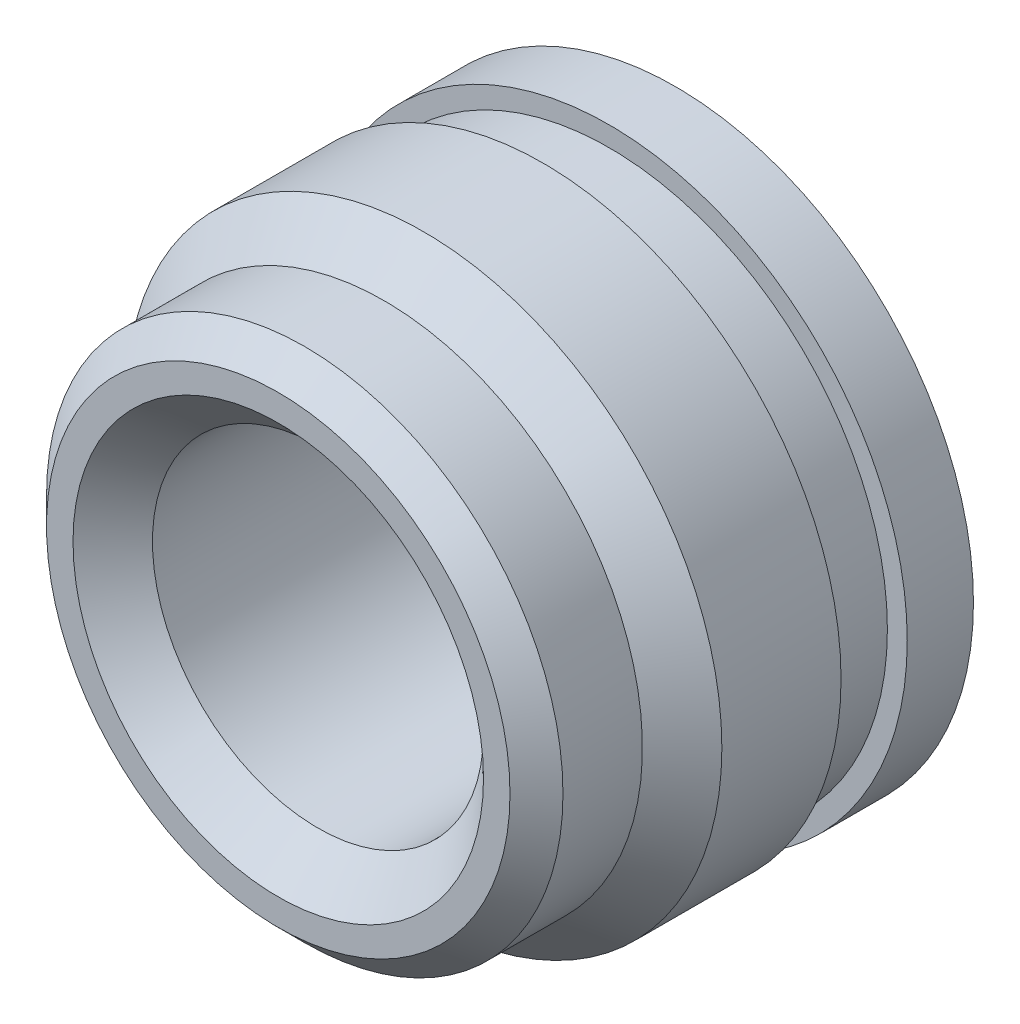
ISO-10303-21;
HEADER;
FILE_DESCRIPTION(('STEP AP214'),'2;1');
FILE_NAME('part.step','',(''),(''),'','','');
FILE_SCHEMA(('AUTOMOTIVE_DESIGN { 1 0 10303 214 1 1 1 1 }'));
ENDSEC;
DATA;
#1=APPLICATION_CONTEXT('core data for automotive mechanical design processes');
#2=APPLICATION_PROTOCOL_DEFINITION('international standard','automotive_design',2000,#1);
#3=PRODUCT_CONTEXT('',#1,'mechanical');
#4=PRODUCT('Part','Part','',(#3));
#5=PRODUCT_RELATED_PRODUCT_CATEGORY('part','',(#4));
#6=PRODUCT_DEFINITION_FORMATION('','',#4);
#7=PRODUCT_DEFINITION_CONTEXT('part definition',#1,'design');
#8=PRODUCT_DEFINITION('design','',#6,#7);
#9=PRODUCT_DEFINITION_SHAPE('','',#8);
#10=(LENGTH_UNIT() NAMED_UNIT(*) SI_UNIT(.MILLI.,.METRE.));
#11=(NAMED_UNIT(*) PLANE_ANGLE_UNIT() SI_UNIT($,.RADIAN.));
#12=(NAMED_UNIT(*) SI_UNIT($,.STERADIAN.) SOLID_ANGLE_UNIT());
#13=UNCERTAINTY_MEASURE_WITH_UNIT(LENGTH_MEASURE(1.E-05),#10,'distance_accuracy_value','');
#14=(GEOMETRIC_REPRESENTATION_CONTEXT(3) GLOBAL_UNCERTAINTY_ASSIGNED_CONTEXT((#13)) GLOBAL_UNIT_ASSIGNED_CONTEXT((#10,
#11,#12)) REPRESENTATION_CONTEXT('',''));
#15=CARTESIAN_POINT('',(0.,0.,0.));
#16=DIRECTION('',(0.,0.,1.));
#17=DIRECTION('',(1.,0.,0.));
#18=AXIS2_PLACEMENT_3D('',#15,#16,#17);
#19=CARTESIAN_POINT('',(0.,0.,0.5));
#20=DIRECTION('',(0.,0.,-1.));
#21=DIRECTION('',(-1.,0.,0.));
#22=AXIS2_PLACEMENT_3D('',#19,#20,#21);
#23=CYLINDRICAL_SURFACE('',#22,2.25);
#24=CARTESIAN_POINT('',(0.,0.,0.5));
#25=DIRECTION('',(0.,0.,1.));
#26=DIRECTION('',(1.,0.,0.));
#27=AXIS2_PLACEMENT_3D('',#24,#25,#26);
#28=CIRCLE('',#27,2.25);
#29=CARTESIAN_POINT('',(2.25,0.,0.5));
#30=VERTEX_POINT('',#29);
#31=EDGE_CURVE('E50',#30,#30,#28,.T.);
#32=ORIENTED_EDGE('',*,*,#31,.F.);
#33=EDGE_LOOP('',(#32));
#34=FACE_BOUND('',#33,.T.);
#35=CARTESIAN_POINT('',(0.,0.,0.));
#36=DIRECTION('',(0.,0.,1.));
#37=DIRECTION('',(1.,0.,0.));
#38=AXIS2_PLACEMENT_3D('',#35,#36,#37);
#39=CIRCLE('',#38,2.25);
#40=CARTESIAN_POINT('',(2.25,0.,0.));
#41=VERTEX_POINT('',#40);
#42=EDGE_CURVE('E48',#41,#41,#39,.T.);
#43=ORIENTED_EDGE('',*,*,#42,.T.);
#44=EDGE_LOOP('',(#43));
#45=FACE_BOUND('',#44,.T.);
#46=ADVANCED_FACE('F15',(#34,#45),#23,.T.);
#47=CARTESIAN_POINT('',(0.,0.,0.5));
#48=DIRECTION('',(0.,0.,1.));
#49=DIRECTION('',(1.,0.,0.));
#50=AXIS2_PLACEMENT_3D('',#47,#48,#49);
#51=PLANE('',#50);
#52=CARTESIAN_POINT('',(0.,0.,0.5));
#53=DIRECTION('',(0.,0.,1.));
#54=DIRECTION('',(1.,0.,0.));
#55=AXIS2_PLACEMENT_3D('',#52,#53,#54);
#56=CIRCLE('',#55,2.1);
#57=CARTESIAN_POINT('',(2.1,0.,0.5));
#58=VERTEX_POINT('',#57);
#59=EDGE_CURVE('E53',#58,#58,#56,.T.);
#60=ORIENTED_EDGE('',*,*,#59,.F.);
#61=EDGE_LOOP('',(#60));
#62=FACE_BOUND('',#61,.T.);
#63=ORIENTED_EDGE('',*,*,#31,.T.);
#64=EDGE_LOOP('',(#63));
#65=FACE_BOUND('',#64,.T.);
#66=ADVANCED_FACE('F84',(#62,#65),#51,.T.);
#67=CARTESIAN_POINT('',(0.,0.,0.));
#68=DIRECTION('',(0.,0.,1.));
#69=DIRECTION('',(1.,0.,0.));
#70=AXIS2_PLACEMENT_3D('',#67,#68,#69);
#71=PLANE('',#70);
#72=CARTESIAN_POINT('',(0.,0.,0.));
#73=DIRECTION('',(0.,0.,1.));
#74=DIRECTION('',(1.,0.,0.));
#75=AXIS2_PLACEMENT_3D('',#72,#73,#74);
#76=CIRCLE('',#75,1.55);
#77=CARTESIAN_POINT('',(1.55,0.,0.));
#78=VERTEX_POINT('',#77);
#79=EDGE_CURVE('E10',#78,#78,#76,.T.);
#80=ORIENTED_EDGE('',*,*,#79,.T.);
#81=EDGE_LOOP('',(#80));
#82=FACE_BOUND('',#81,.T.);
#83=ORIENTED_EDGE('',*,*,#42,.F.);
#84=EDGE_LOOP('',(#83));
#85=FACE_BOUND('',#84,.T.);
#86=ADVANCED_FACE('F89',(#82,#85),#71,.F.);
#87=CARTESIAN_POINT('',(0.,0.,1.));
#88=DIRECTION('',(0.,0.,-1.));
#89=DIRECTION('',(-1.,0.,0.));
#90=AXIS2_PLACEMENT_3D('',#87,#88,#89);
#91=CYLINDRICAL_SURFACE('',#90,2.1);
#92=CARTESIAN_POINT('',(0.,0.,1.));
#93=DIRECTION('',(0.,0.,1.));
#94=DIRECTION('',(1.,0.,0.));
#95=AXIS2_PLACEMENT_3D('',#92,#93,#94);
#96=CIRCLE('',#95,2.1);
#97=CARTESIAN_POINT('',(2.1,0.,1.));
#98=VERTEX_POINT('',#97);
#99=EDGE_CURVE('E51',#98,#98,#96,.T.);
#100=ORIENTED_EDGE('',*,*,#99,.F.);
#101=EDGE_LOOP('',(#100));
#102=FACE_BOUND('',#101,.T.);
#103=ORIENTED_EDGE('',*,*,#59,.T.);
#104=EDGE_LOOP('',(#103));
#105=FACE_BOUND('',#104,.T.);
#106=ADVANCED_FACE('F78',(#102,#105),#91,.T.);
#107=CARTESIAN_POINT('',(0.,0.,2.5));
#108=DIRECTION('',(0.,0.,-1.));
#109=DIRECTION('',(-1.,0.,0.));
#110=AXIS2_PLACEMENT_3D('',#107,#108,#109);
#111=CYLINDRICAL_SURFACE('',#110,2.25);
#112=CARTESIAN_POINT('',(0.,0.,1.9));
#113=DIRECTION('',(0.,0.,1.));
#114=DIRECTION('',(1.,0.,0.));
#115=AXIS2_PLACEMENT_3D('',#112,#113,#114);
#116=CIRCLE('',#115,2.25);
#117=CARTESIAN_POINT('',(2.25,0.,1.9));
#118=VERTEX_POINT('',#117);
#119=EDGE_CURVE('E36',#118,#118,#116,.F.);
#120=ORIENTED_EDGE('',*,*,#119,.T.);
#121=EDGE_LOOP('',(#120));
#122=FACE_BOUND('',#121,.T.);
#123=CARTESIAN_POINT('',(0.,0.,1.));
#124=DIRECTION('',(0.,0.,1.));
#125=DIRECTION('',(1.,0.,0.));
#126=AXIS2_PLACEMENT_3D('',#123,#124,#125);
#127=CIRCLE('',#126,2.25);
#128=CARTESIAN_POINT('',(2.25,0.,1.));
#129=VERTEX_POINT('',#128);
#130=EDGE_CURVE('E60',#129,#129,#127,.T.);
#131=ORIENTED_EDGE('',*,*,#130,.T.);
#132=EDGE_LOOP('',(#131));
#133=FACE_BOUND('',#132,.T.);
#134=ADVANCED_FACE('F64',(#122,#133),#111,.T.);
#135=CARTESIAN_POINT('',(0.,0.,1.));
#136=DIRECTION('',(0.,0.,1.));
#137=DIRECTION('',(1.,0.,0.));
#138=AXIS2_PLACEMENT_3D('',#135,#136,#137);
#139=PLANE('',#138);
#140=ORIENTED_EDGE('',*,*,#99,.T.);
#141=EDGE_LOOP('',(#140));
#142=FACE_BOUND('',#141,.T.);
#143=ORIENTED_EDGE('',*,*,#130,.F.);
#144=EDGE_LOOP('',(#143));
#145=FACE_BOUND('',#144,.T.);
#146=ADVANCED_FACE('F65',(#142,#145),#139,.F.);
#147=CARTESIAN_POINT('',(0.,0.,3.));
#148=DIRECTION('',(0.,0.,-1.));
#149=DIRECTION('',(-1.,0.,0.));
#150=AXIS2_PLACEMENT_3D('',#147,#148,#149);
#151=CYLINDRICAL_SURFACE('',#150,1.95);
#152=CARTESIAN_POINT('',(0.,0.,2.2));
#153=DIRECTION('',(0.,0.,-1.));
#154=DIRECTION('',(-1.,0.,0.));
#155=AXIS2_PLACEMENT_3D('',#152,#153,#154);
#156=CIRCLE('',#155,1.95);
#157=CARTESIAN_POINT('',(-1.95,0.,2.2));
#158=VERTEX_POINT('',#157);
#159=EDGE_CURVE('E34',#158,#158,#156,.F.);
#160=ORIENTED_EDGE('',*,*,#159,.T.);
#161=EDGE_LOOP('',(#160));
#162=FACE_BOUND('',#161,.T.);
#163=CARTESIAN_POINT('',(0.,0.,2.8));
#164=DIRECTION('',(0.,0.,1.));
#165=DIRECTION('',(1.,0.,0.));
#166=AXIS2_PLACEMENT_3D('',#163,#164,#165);
#167=CIRCLE('',#166,1.95);
#168=CARTESIAN_POINT('',(1.95,0.,2.8));
#169=VERTEX_POINT('',#168);
#170=EDGE_CURVE('E41',#169,#169,#167,.F.);
#171=ORIENTED_EDGE('',*,*,#170,.T.);
#172=EDGE_LOOP('',(#171));
#173=FACE_BOUND('',#172,.T.);
#174=ADVANCED_FACE('F66',(#162,#173),#151,.T.);
#175=CARTESIAN_POINT('',(0.,0.,3.));
#176=DIRECTION('',(0.,0.,1.));
#177=DIRECTION('',(1.,0.,0.));
#178=AXIS2_PLACEMENT_3D('',#175,#176,#177);
#179=PLANE('',#178);
#180=CARTESIAN_POINT('',(0.,0.,3.));
#181=DIRECTION('',(0.,0.,1.));
#182=DIRECTION('',(1.,0.,0.));
#183=AXIS2_PLACEMENT_3D('',#180,#181,#182);
#184=CIRCLE('',#183,1.55);
#185=CARTESIAN_POINT('',(1.55,0.,3.));
#186=VERTEX_POINT('',#185);
#187=EDGE_CURVE('E22',#186,#186,#184,.F.);
#188=ORIENTED_EDGE('',*,*,#187,.T.);
#189=EDGE_LOOP('',(#188));
#190=FACE_BOUND('',#189,.T.);
#191=CARTESIAN_POINT('',(0.,0.,3.));
#192=DIRECTION('',(0.,0.,1.));
#193=DIRECTION('',(1.,0.,0.));
#194=AXIS2_PLACEMENT_3D('',#191,#192,#193);
#195=CIRCLE('',#194,1.75);
#196=CARTESIAN_POINT('',(1.75,0.,3.));
#197=VERTEX_POINT('',#196);
#198=EDGE_CURVE('E42',#197,#197,#195,.T.);
#199=ORIENTED_EDGE('',*,*,#198,.T.);
#200=EDGE_LOOP('',(#199));
#201=FACE_BOUND('',#200,.T.);
#202=ADVANCED_FACE('F76',(#190,#201),#179,.T.);
#203=CARTESIAN_POINT('',(0.,0.,0.));
#204=DIRECTION('',(0.,0.,1.));
#205=DIRECTION('',(1.,0.,0.));
#206=AXIS2_PLACEMENT_3D('',#203,#204,#205);
#207=CYLINDRICAL_SURFACE('',#206,1.25);
#208=CARTESIAN_POINT('',(0.,0.,2.7));
#209=DIRECTION('',(0.,0.,1.));
#210=DIRECTION('',(1.,0.,0.));
#211=AXIS2_PLACEMENT_3D('',#208,#209,#210);
#212=CIRCLE('',#211,1.25);
#213=CARTESIAN_POINT('',(1.25,0.,2.7));
#214=VERTEX_POINT('',#213);
#215=EDGE_CURVE('E27',#214,#214,#212,.T.);
#216=ORIENTED_EDGE('',*,*,#215,.T.);
#217=EDGE_LOOP('',(#216));
#218=FACE_BOUND('',#217,.T.);
#219=CARTESIAN_POINT('',(0.,0.,0.3));
#220=DIRECTION('',(0.,0.,1.));
#221=DIRECTION('',(1.,0.,0.));
#222=AXIS2_PLACEMENT_3D('',#219,#220,#221);
#223=CIRCLE('',#222,1.25);
#224=CARTESIAN_POINT('',(1.25,0.,0.3));
#225=VERTEX_POINT('',#224);
#226=EDGE_CURVE('E28',#225,#225,#223,.F.);
#227=ORIENTED_EDGE('',*,*,#226,.T.);
#228=EDGE_LOOP('',(#227));
#229=FACE_BOUND('',#228,.T.);
#230=ADVANCED_FACE('F101',(#218,#229),#207,.F.);
#231=CARTESIAN_POINT('',(0.,0.,3.));
#232=DIRECTION('',(0.,0.,-1.));
#233=DIRECTION('',(-1.,0.,0.));
#234=AXIS2_PLACEMENT_3D('',#231,#232,#233);
#235=CONICAL_SURFACE('',#234,1.75,0.785398163397446);
#236=ORIENTED_EDGE('',*,*,#170,.F.);
#237=EDGE_LOOP('',(#236));
#238=FACE_BOUND('',#237,.T.);
#239=ORIENTED_EDGE('',*,*,#198,.F.);
#240=EDGE_LOOP('',(#239));
#241=FACE_BOUND('',#240,.T.);
#242=ADVANCED_FACE('F100',(#238,#241),#235,.T.);
#243=CARTESIAN_POINT('',(0.,0.,2.5));
#244=DIRECTION('',(0.,0.,-1.));
#245=DIRECTION('',(-1.,0.,0.));
#246=AXIS2_PLACEMENT_3D('',#243,#244,#245);
#247=CONICAL_SURFACE('',#246,1.65,0.785398163397453);
#248=ORIENTED_EDGE('',*,*,#119,.F.);
#249=EDGE_LOOP('',(#248));
#250=FACE_BOUND('',#249,.T.);
#251=ORIENTED_EDGE('',*,*,#159,.F.);
#252=EDGE_LOOP('',(#251));
#253=FACE_BOUND('',#252,.T.);
#254=ADVANCED_FACE('F99',(#250,#253),#247,.T.);
#255=CARTESIAN_POINT('',(0.,0.,2.7));
#256=DIRECTION('',(0.,0.,1.));
#257=DIRECTION('',(1.,0.,0.));
#258=AXIS2_PLACEMENT_3D('',#255,#256,#257);
#259=CONICAL_SURFACE('',#258,1.25,0.785398163397449);
#260=ORIENTED_EDGE('',*,*,#187,.F.);
#261=EDGE_LOOP('',(#260));
#262=FACE_BOUND('',#261,.T.);
#263=ORIENTED_EDGE('',*,*,#215,.F.);
#264=EDGE_LOOP('',(#263));
#265=FACE_BOUND('',#264,.T.);
#266=ADVANCED_FACE('F102',(#262,#265),#259,.F.);
#267=CARTESIAN_POINT('',(0.,0.,0.));
#268=DIRECTION('',(0.,0.,-1.));
#269=DIRECTION('',(-1.,0.,0.));
#270=AXIS2_PLACEMENT_3D('',#267,#268,#269);
#271=CONICAL_SURFACE('',#270,1.55,0.785398163397447);
#272=ORIENTED_EDGE('',*,*,#226,.F.);
#273=EDGE_LOOP('',(#272));
#274=FACE_BOUND('',#273,.T.);
#275=ORIENTED_EDGE('',*,*,#79,.F.);
#276=EDGE_LOOP('',(#275));
#277=FACE_BOUND('',#276,.T.);
#278=ADVANCED_FACE('F17',(#274,#277),#271,.F.);
#279=CLOSED_SHELL('',(#46,#66,#86,#106,#134,#146,#174,#202,#230,#242,#254,#266,#278));
#280=MANIFOLD_SOLID_BREP('B1',#279);
#281=ADVANCED_BREP_SHAPE_REPRESENTATION('',(#18,#280),#14);
#282=SHAPE_DEFINITION_REPRESENTATION(#9,#281);
ENDSEC;
END-ISO-10303-21;
